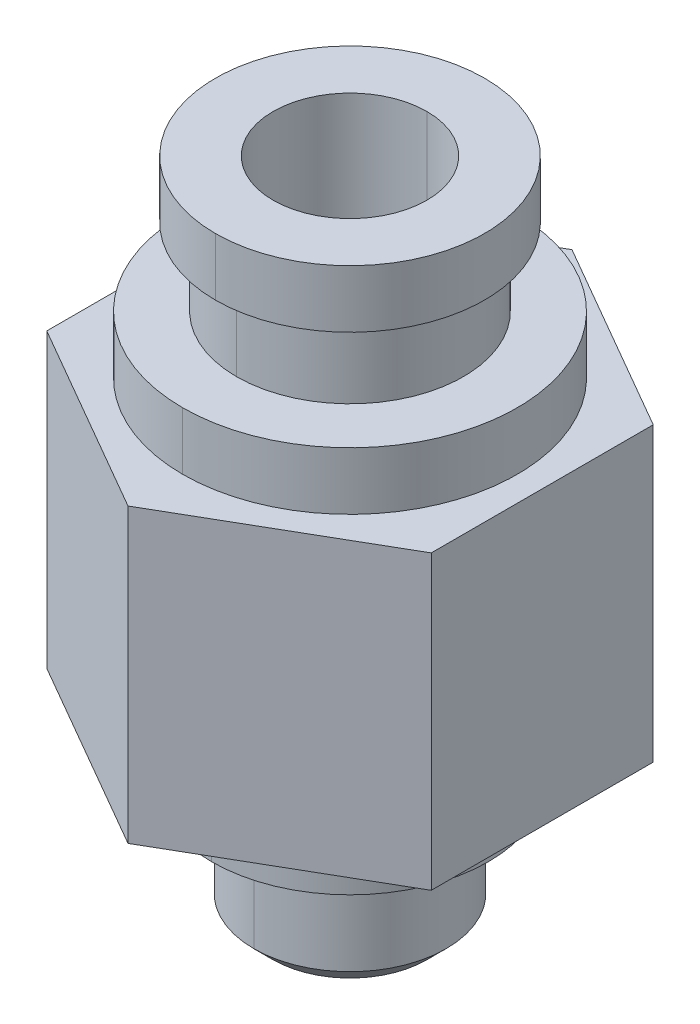
ISO-10303-21;
HEADER;
FILE_DESCRIPTION(('STEP AP214'),'2;1');
FILE_NAME('part.step','',(''),(''),'','','');
FILE_SCHEMA(('AUTOMOTIVE_DESIGN { 1 0 10303 214 1 1 1 1 }'));
ENDSEC;
DATA;
#1=APPLICATION_CONTEXT('core data for automotive mechanical design processes');
#2=APPLICATION_PROTOCOL_DEFINITION('international standard','automotive_design',2000,#1);
#3=PRODUCT_CONTEXT('',#1,'mechanical');
#4=PRODUCT('Part','Part','',(#3));
#5=PRODUCT_RELATED_PRODUCT_CATEGORY('part','',(#4));
#6=PRODUCT_DEFINITION_FORMATION('','',#4);
#7=PRODUCT_DEFINITION_CONTEXT('part definition',#1,'design');
#8=PRODUCT_DEFINITION('design','',#6,#7);
#9=PRODUCT_DEFINITION_SHAPE('','',#8);
#10=(LENGTH_UNIT() NAMED_UNIT(*) SI_UNIT(.MILLI.,.METRE.));
#11=(NAMED_UNIT(*) PLANE_ANGLE_UNIT() SI_UNIT($,.RADIAN.));
#12=(NAMED_UNIT(*) SI_UNIT($,.STERADIAN.) SOLID_ANGLE_UNIT());
#13=UNCERTAINTY_MEASURE_WITH_UNIT(LENGTH_MEASURE(1.E-05),#10,'distance_accuracy_value','');
#14=(GEOMETRIC_REPRESENTATION_CONTEXT(3) GLOBAL_UNCERTAINTY_ASSIGNED_CONTEXT((#13)) GLOBAL_UNIT_ASSIGNED_CONTEXT((#10,
#11,#12)) REPRESENTATION_CONTEXT('',''));
#15=CARTESIAN_POINT('',(0.,0.,0.));
#16=DIRECTION('',(0.,0.,1.));
#17=DIRECTION('',(1.,0.,0.));
#18=AXIS2_PLACEMENT_3D('',#15,#16,#17);
#19=CARTESIAN_POINT('',(0.,4.5,0.));
#20=DIRECTION('',(0.,1.,0.));
#21=DIRECTION('',(0.,0.,1.));
#22=AXIS2_PLACEMENT_3D('',#19,#20,#21);
#23=PLANE('',#22);
#24=CARTESIAN_POINT('',(0.,4.5,0.));
#25=DIRECTION('',(0.,-1.,0.));
#26=DIRECTION('',(0.,0.,-1.));
#27=AXIS2_PLACEMENT_3D('',#24,#25,#26);
#28=CIRCLE('',#27,3.6);
#29=CARTESIAN_POINT('',(0.,4.5,3.6));
#30=VERTEX_POINT('',#29);
#31=CARTESIAN_POINT('',(0.,4.5,-3.6));
#32=VERTEX_POINT('',#31);
#33=EDGE_CURVE('E120',#30,#32,#28,.T.);
#34=ORIENTED_EDGE('',*,*,#33,.F.);
#35=CARTESIAN_POINT('',(0.,4.5,0.));
#36=DIRECTION('',(0.,-1.,0.));
#37=DIRECTION('',(0.,0.,-1.));
#38=AXIS2_PLACEMENT_3D('',#35,#36,#37);
#39=CIRCLE('',#38,3.6);
#40=EDGE_CURVE('E20',#32,#30,#39,.T.);
#41=ORIENTED_EDGE('',*,*,#40,.F.);
#42=EDGE_LOOP('',(#34,#41));
#43=FACE_BOUND('',#42,.T.);
#44=DIRECTION('',(-0.866025403784439,0.,0.5));
#45=VECTOR('',#44,1.);
#46=CARTESIAN_POINT('',(0.,4.5,5.77350269189626));
#47=LINE('',#46,#45);
#48=CARTESIAN_POINT('',(5.,4.5,2.88675134594813));
#49=VERTEX_POINT('',#48);
#50=CARTESIAN_POINT('',(0.,4.5,5.77350269189626));
#51=VERTEX_POINT('',#50);
#52=EDGE_CURVE('E221',#49,#51,#47,.T.);
#53=ORIENTED_EDGE('',*,*,#52,.T.);
#54=DIRECTION('',(-0.866025403784439,0.,-0.5));
#55=VECTOR('',#54,1.);
#56=CARTESIAN_POINT('',(-5.,4.5,2.88675134594813));
#57=LINE('',#56,#55);
#58=CARTESIAN_POINT('',(-5.,4.5,2.88675134594813));
#59=VERTEX_POINT('',#58);
#60=EDGE_CURVE('E140',#51,#59,#57,.T.);
#61=ORIENTED_EDGE('',*,*,#60,.T.);
#62=DIRECTION('',(0.,0.,-1.));
#63=VECTOR('',#62,1.);
#64=CARTESIAN_POINT('',(-5.,4.5,-2.88675134594813));
#65=LINE('',#64,#63);
#66=CARTESIAN_POINT('',(-5.,4.5,-2.88675134594813));
#67=VERTEX_POINT('',#66);
#68=EDGE_CURVE('E248',#59,#67,#65,.T.);
#69=ORIENTED_EDGE('',*,*,#68,.T.);
#70=DIRECTION('',(0.866025403784439,0.,-0.5));
#71=VECTOR('',#70,1.);
#72=CARTESIAN_POINT('',(0.,4.5,-5.77350269189626));
#73=LINE('',#72,#71);
#74=CARTESIAN_POINT('',(0.,4.5,-5.77350269189626));
#75=VERTEX_POINT('',#74);
#76=EDGE_CURVE('E239',#67,#75,#73,.T.);
#77=ORIENTED_EDGE('',*,*,#76,.T.);
#78=DIRECTION('',(0.866025403784439,0.,0.5));
#79=VECTOR('',#78,1.);
#80=CARTESIAN_POINT('',(5.,4.5,-2.88675134594813));
#81=LINE('',#80,#79);
#82=CARTESIAN_POINT('',(5.,4.5,-2.88675134594813));
#83=VERTEX_POINT('',#82);
#84=EDGE_CURVE('E233',#75,#83,#81,.T.);
#85=ORIENTED_EDGE('',*,*,#84,.T.);
#86=DIRECTION('',(0.,0.,1.));
#87=VECTOR('',#86,1.);
#88=CARTESIAN_POINT('',(5.,4.5,2.88675134594813));
#89=LINE('',#88,#87);
#90=EDGE_CURVE('E227',#83,#49,#89,.T.);
#91=ORIENTED_EDGE('',*,*,#90,.T.);
#92=EDGE_LOOP('',(#53,#61,#69,#77,#85,#91));
#93=FACE_BOUND('',#92,.T.);
#94=ADVANCED_FACE('F17',(#43,#93),#23,.F.);
#95=CARTESIAN_POINT('',(0.,4.5,0.));
#96=DIRECTION('',(0.,-1.,0.));
#97=DIRECTION('',(0.,0.,-1.));
#98=AXIS2_PLACEMENT_3D('',#95,#96,#97);
#99=CYLINDRICAL_SURFACE('',#98,3.6);
#100=CARTESIAN_POINT('',(0.,3.,0.));
#101=DIRECTION('',(0.,-1.,0.));
#102=DIRECTION('',(0.,0.,-1.));
#103=AXIS2_PLACEMENT_3D('',#100,#101,#102);
#104=CIRCLE('',#103,3.6);
#105=CARTESIAN_POINT('',(0.,3.,3.6));
#106=VERTEX_POINT('',#105);
#107=CARTESIAN_POINT('',(0.,3.,-3.6));
#108=VERTEX_POINT('',#107);
#109=EDGE_CURVE('E143',#106,#108,#104,.F.);
#110=ORIENTED_EDGE('',*,*,#109,.T.);
#111=DIRECTION('',(0.,-1.,0.));
#112=VECTOR('',#111,1.);
#113=CARTESIAN_POINT('',(0.,4.5,-3.6));
#114=LINE('',#113,#112);
#115=EDGE_CURVE('E133',#32,#108,#114,.T.);
#116=ORIENTED_EDGE('',*,*,#115,.F.);
#117=ORIENTED_EDGE('',*,*,#40,.T.);
#118=DIRECTION('',(0.,-1.,0.));
#119=VECTOR('',#118,1.);
#120=CARTESIAN_POINT('',(0.,4.5,3.6));
#121=LINE('',#120,#119);
#122=EDGE_CURVE('E131',#106,#30,#121,.F.);
#123=ORIENTED_EDGE('',*,*,#122,.F.);
#124=EDGE_LOOP('',(#110,#116,#117,#123));
#125=FACE_BOUND('',#124,.T.);
#126=ADVANCED_FACE('F130',(#125),#99,.T.);
#127=CARTESIAN_POINT('',(0.,4.5,0.));
#128=DIRECTION('',(0.,-1.,0.));
#129=DIRECTION('',(0.,0.,-1.));
#130=AXIS2_PLACEMENT_3D('',#127,#128,#129);
#131=CYLINDRICAL_SURFACE('',#130,3.6);
#132=ORIENTED_EDGE('',*,*,#115,.T.);
#133=CARTESIAN_POINT('',(0.,3.,0.));
#134=DIRECTION('',(0.,-1.,0.));
#135=DIRECTION('',(0.,0.,-1.));
#136=AXIS2_PLACEMENT_3D('',#133,#134,#135);
#137=CIRCLE('',#136,3.6);
#138=EDGE_CURVE('E137',#108,#106,#137,.F.);
#139=ORIENTED_EDGE('',*,*,#138,.T.);
#140=ORIENTED_EDGE('',*,*,#122,.T.);
#141=ORIENTED_EDGE('',*,*,#33,.T.);
#142=EDGE_LOOP('',(#132,#139,#140,#141));
#143=FACE_BOUND('',#142,.T.);
#144=ADVANCED_FACE('F135',(#143),#131,.T.);
#145=CARTESIAN_POINT('',(-5.,12.1,2.88675134594813));
#146=DIRECTION('',(0.5,0.,-0.866025403784439));
#147=DIRECTION('',(-0.866025403784439,0.,-0.5));
#148=AXIS2_PLACEMENT_3D('',#145,#146,#147);
#149=PLANE('',#148);
#150=DIRECTION('',(0.,1.,0.));
#151=VECTOR('',#150,1.);
#152=CARTESIAN_POINT('',(-5.,12.1,2.88675134594813));
#153=LINE('',#152,#151);
#154=CARTESIAN_POINT('',(-5.,12.1,2.88675134594813));
#155=VERTEX_POINT('',#154);
#156=EDGE_CURVE('E245',#155,#59,#153,.F.);
#157=ORIENTED_EDGE('',*,*,#156,.T.);
#158=ORIENTED_EDGE('',*,*,#60,.F.);
#159=DIRECTION('',(0.,1.,0.));
#160=VECTOR('',#159,1.);
#161=CARTESIAN_POINT('',(0.,12.1,5.77350269189626));
#162=LINE('',#161,#160);
#163=CARTESIAN_POINT('',(0.,12.1,5.77350269189626));
#164=VERTEX_POINT('',#163);
#165=EDGE_CURVE('E224',#51,#164,#162,.T.);
#166=ORIENTED_EDGE('',*,*,#165,.T.);
#167=DIRECTION('',(0.866025403784439,0.,0.5));
#168=VECTOR('',#167,1.);
#169=CARTESIAN_POINT('',(-5.,12.1,2.88675134594813));
#170=LINE('',#169,#168);
#171=EDGE_CURVE('E147',#155,#164,#170,.T.);
#172=ORIENTED_EDGE('',*,*,#171,.F.);
#173=EDGE_LOOP('',(#157,#158,#166,#172));
#174=FACE_BOUND('',#173,.T.);
#175=ADVANCED_FACE('F457',(#174),#149,.F.);
#176=CARTESIAN_POINT('',(0.,12.1,5.77350269189626));
#177=DIRECTION('',(-0.5,0.,-0.866025403784439));
#178=DIRECTION('',(-0.866025403784439,0.,0.5));
#179=AXIS2_PLACEMENT_3D('',#176,#177,#178);
#180=PLANE('',#179);
#181=ORIENTED_EDGE('',*,*,#165,.F.);
#182=ORIENTED_EDGE('',*,*,#52,.F.);
#183=DIRECTION('',(0.,1.,0.));
#184=VECTOR('',#183,1.);
#185=CARTESIAN_POINT('',(5.,12.1,2.88675134594813));
#186=LINE('',#185,#184);
#187=CARTESIAN_POINT('',(5.,12.1,2.88675134594813));
#188=VERTEX_POINT('',#187);
#189=EDGE_CURVE('E230',#49,#188,#186,.T.);
#190=ORIENTED_EDGE('',*,*,#189,.T.);
#191=DIRECTION('',(0.866025403784439,0.,-0.5));
#192=VECTOR('',#191,1.);
#193=CARTESIAN_POINT('',(0.,12.1,5.77350269189626));
#194=LINE('',#193,#192);
#195=EDGE_CURVE('E255',#164,#188,#194,.T.);
#196=ORIENTED_EDGE('',*,*,#195,.F.);
#197=EDGE_LOOP('',(#181,#182,#190,#196));
#198=FACE_BOUND('',#197,.T.);
#199=ADVANCED_FACE('F453',(#198),#180,.F.);
#200=CARTESIAN_POINT('',(5.,12.1,2.88675134594813));
#201=DIRECTION('',(-1.,0.,0.));
#202=DIRECTION('',(0.,0.,1.));
#203=AXIS2_PLACEMENT_3D('',#200,#201,#202);
#204=PLANE('',#203);
#205=ORIENTED_EDGE('',*,*,#189,.F.);
#206=ORIENTED_EDGE('',*,*,#90,.F.);
#207=DIRECTION('',(0.,1.,0.));
#208=VECTOR('',#207,1.);
#209=CARTESIAN_POINT('',(5.,12.1,-2.88675134594813));
#210=LINE('',#209,#208);
#211=CARTESIAN_POINT('',(5.,12.1,-2.88675134594813));
#212=VERTEX_POINT('',#211);
#213=EDGE_CURVE('E236',#83,#212,#210,.T.);
#214=ORIENTED_EDGE('',*,*,#213,.T.);
#215=DIRECTION('',(0.,0.,1.));
#216=VECTOR('',#215,1.);
#217=CARTESIAN_POINT('',(5.,12.1,0.));
#218=LINE('',#217,#216);
#219=EDGE_CURVE('E258',#188,#212,#218,.F.);
#220=ORIENTED_EDGE('',*,*,#219,.F.);
#221=EDGE_LOOP('',(#205,#206,#214,#220));
#222=FACE_BOUND('',#221,.T.);
#223=ADVANCED_FACE('F449',(#222),#204,.F.);
#224=CARTESIAN_POINT('',(5.,12.1,-2.88675134594813));
#225=DIRECTION('',(-0.5,0.,0.866025403784439));
#226=DIRECTION('',(0.866025403784439,0.,0.5));
#227=AXIS2_PLACEMENT_3D('',#224,#225,#226);
#228=PLANE('',#227);
#229=ORIENTED_EDGE('',*,*,#213,.F.);
#230=ORIENTED_EDGE('',*,*,#84,.F.);
#231=DIRECTION('',(0.,1.,0.));
#232=VECTOR('',#231,1.);
#233=CARTESIAN_POINT('',(0.,12.1,-5.77350269189626));
#234=LINE('',#233,#232);
#235=CARTESIAN_POINT('',(0.,12.1,-5.77350269189626));
#236=VERTEX_POINT('',#235);
#237=EDGE_CURVE('E242',#75,#236,#234,.T.);
#238=ORIENTED_EDGE('',*,*,#237,.T.);
#239=DIRECTION('',(-0.866025403784439,0.,-0.5));
#240=VECTOR('',#239,1.);
#241=CARTESIAN_POINT('',(5.,12.1,-2.88675134594813));
#242=LINE('',#241,#240);
#243=EDGE_CURVE('E261',#212,#236,#242,.T.);
#244=ORIENTED_EDGE('',*,*,#243,.F.);
#245=EDGE_LOOP('',(#229,#230,#238,#244));
#246=FACE_BOUND('',#245,.T.);
#247=ADVANCED_FACE('F445',(#246),#228,.F.);
#248=CARTESIAN_POINT('',(0.,12.1,-5.77350269189626));
#249=DIRECTION('',(0.5,0.,0.866025403784439));
#250=DIRECTION('',(0.866025403784439,0.,-0.5));
#251=AXIS2_PLACEMENT_3D('',#248,#249,#250);
#252=PLANE('',#251);
#253=ORIENTED_EDGE('',*,*,#237,.F.);
#254=ORIENTED_EDGE('',*,*,#76,.F.);
#255=DIRECTION('',(0.,1.,0.));
#256=VECTOR('',#255,1.);
#257=CARTESIAN_POINT('',(-5.,12.1,-2.88675134594813));
#258=LINE('',#257,#256);
#259=CARTESIAN_POINT('',(-5.,12.1,-2.88675134594813));
#260=VERTEX_POINT('',#259);
#261=EDGE_CURVE('E145',#67,#260,#258,.T.);
#262=ORIENTED_EDGE('',*,*,#261,.T.);
#263=DIRECTION('',(-0.866025403784439,0.,0.5));
#264=VECTOR('',#263,1.);
#265=CARTESIAN_POINT('',(0.,12.1,-5.77350269189626));
#266=LINE('',#265,#264);
#267=EDGE_CURVE('E264',#236,#260,#266,.T.);
#268=ORIENTED_EDGE('',*,*,#267,.F.);
#269=EDGE_LOOP('',(#253,#254,#262,#268));
#270=FACE_BOUND('',#269,.T.);
#271=ADVANCED_FACE('F441',(#270),#252,.F.);
#272=CARTESIAN_POINT('',(-5.,12.1,-2.88675134594813));
#273=DIRECTION('',(1.,0.,0.));
#274=DIRECTION('',(0.,0.,-1.));
#275=AXIS2_PLACEMENT_3D('',#272,#273,#274);
#276=PLANE('',#275);
#277=ORIENTED_EDGE('',*,*,#261,.F.);
#278=ORIENTED_EDGE('',*,*,#68,.F.);
#279=ORIENTED_EDGE('',*,*,#156,.F.);
#280=DIRECTION('',(0.,0.,1.));
#281=VECTOR('',#280,1.);
#282=CARTESIAN_POINT('',(-5.,12.1,0.));
#283=LINE('',#282,#281);
#284=EDGE_CURVE('E151',#260,#155,#283,.T.);
#285=ORIENTED_EDGE('',*,*,#284,.F.);
#286=EDGE_LOOP('',(#277,#278,#279,#285));
#287=FACE_BOUND('',#286,.T.);
#288=ADVANCED_FACE('F437',(#287),#276,.F.);
#289=CARTESIAN_POINT('',(0.,3.,2.0095));
#290=DIRECTION('',(0.,1.,0.));
#291=DIRECTION('',(0.,0.,1.));
#292=AXIS2_PLACEMENT_3D('',#289,#290,#291);
#293=PLANE('',#292);
#294=CARTESIAN_POINT('',(0.,3.00000000004275,0.));
#295=DIRECTION('',(0.,-1.,0.));
#296=DIRECTION('',(0.,0.,-1.));
#297=AXIS2_PLACEMENT_3D('',#294,#295,#296);
#298=CIRCLE('',#297,2.00949999998556);
#299=CARTESIAN_POINT('',(0.,3.00000000004275,2.00949999998556));
#300=VERTEX_POINT('',#299);
#301=CARTESIAN_POINT('',(0.,3.00000000004275,-2.00949999998556));
#302=VERTEX_POINT('',#301);
#303=EDGE_CURVE('E148',#300,#302,#298,.T.);
#304=ORIENTED_EDGE('',*,*,#303,.F.);
#305=CARTESIAN_POINT('',(0.,3.00000000004275,0.));
#306=DIRECTION('',(0.,-1.,0.));
#307=DIRECTION('',(0.,0.,-1.));
#308=AXIS2_PLACEMENT_3D('',#305,#306,#307);
#309=CIRCLE('',#308,2.00949999998556);
#310=EDGE_CURVE('E150',#302,#300,#309,.T.);
#311=ORIENTED_EDGE('',*,*,#310,.F.);
#312=EDGE_LOOP('',(#304,#311));
#313=FACE_BOUND('',#312,.T.);
#314=ORIENTED_EDGE('',*,*,#109,.F.);
#315=ORIENTED_EDGE('',*,*,#138,.F.);
#316=EDGE_LOOP('',(#314,#315));
#317=FACE_BOUND('',#316,.T.);
#318=ADVANCED_FACE('F433',(#313,#317),#293,.F.);
#319=CARTESIAN_POINT('',(0.,12.1,0.));
#320=DIRECTION('',(0.,1.,0.));
#321=DIRECTION('',(0.,0.,1.));
#322=AXIS2_PLACEMENT_3D('',#319,#320,#321);
#323=PLANE('',#322);
#324=CARTESIAN_POINT('',(0.,12.1,0.));
#325=DIRECTION('',(0.,-1.,0.));
#326=DIRECTION('',(0.,0.,-1.));
#327=AXIS2_PLACEMENT_3D('',#324,#325,#326);
#328=CIRCLE('',#327,4.35);
#329=CARTESIAN_POINT('',(0.,12.1,-4.35));
#330=VERTEX_POINT('',#329);
#331=CARTESIAN_POINT('',(0.,12.1,4.35));
#332=VERTEX_POINT('',#331);
#333=EDGE_CURVE('E154',#330,#332,#328,.F.);
#334=ORIENTED_EDGE('',*,*,#333,.F.);
#335=CARTESIAN_POINT('',(0.,12.1,0.));
#336=DIRECTION('',(0.,-1.,0.));
#337=DIRECTION('',(0.,0.,-1.));
#338=AXIS2_PLACEMENT_3D('',#335,#336,#337);
#339=CIRCLE('',#338,4.35);
#340=EDGE_CURVE('E158',#332,#330,#339,.F.);
#341=ORIENTED_EDGE('',*,*,#340,.F.);
#342=EDGE_LOOP('',(#334,#341));
#343=FACE_BOUND('',#342,.T.);
#344=ORIENTED_EDGE('',*,*,#267,.T.);
#345=ORIENTED_EDGE('',*,*,#284,.T.);
#346=ORIENTED_EDGE('',*,*,#171,.T.);
#347=ORIENTED_EDGE('',*,*,#195,.T.);
#348=ORIENTED_EDGE('',*,*,#219,.T.);
#349=ORIENTED_EDGE('',*,*,#243,.T.);
#350=EDGE_LOOP('',(#344,#345,#346,#347,#348,#349));
#351=FACE_BOUND('',#350,.T.);
#352=ADVANCED_FACE('F429',(#343,#351),#323,.T.);
#353=CARTESIAN_POINT('',(0.,2.50950000008743,0.));
#354=DIRECTION('',(0.,-1.,0.));
#355=DIRECTION('',(0.,0.,-1.));
#356=AXIS2_PLACEMENT_3D('',#353,#354,#355);
#357=CONICAL_SURFACE('',#356,2.49999999994088,0.785398163397448);
#358=DIRECTION('',(0.,0.707106781186548,0.707106781186548));
#359=VECTOR('',#358,1.);
#360=CARTESIAN_POINT('',(0.,-498994.9905,-499000.));
#361=LINE('',#360,#359);
#362=CARTESIAN_POINT('',(0.,2.50950000000216,-2.49999999998522));
#363=VERTEX_POINT('',#362);
#364=EDGE_CURVE('E157',#363,#302,#361,.T.);
#365=ORIENTED_EDGE('',*,*,#364,.F.);
#366=CARTESIAN_POINT('',(0.,2.50949999997374,0.));
#367=DIRECTION('',(0.,-1.,0.));
#368=DIRECTION('',(0.,0.,-1.));
#369=AXIS2_PLACEMENT_3D('',#366,#367,#368);
#370=CIRCLE('',#369,2.5);
#371=CARTESIAN_POINT('',(0.,2.50950000000216,2.49999999998522));
#372=VERTEX_POINT('',#371);
#373=EDGE_CURVE('E283',#372,#363,#370,.T.);
#374=ORIENTED_EDGE('',*,*,#373,.F.);
#375=DIRECTION('',(0.,0.707106781186548,-0.707106781186548));
#376=VECTOR('',#375,1.);
#377=CARTESIAN_POINT('',(6.11098752774529E-11,-498994.9905,499000.));
#378=LINE('',#377,#376);
#379=EDGE_CURVE('E153',#300,#372,#378,.F.);
#380=ORIENTED_EDGE('',*,*,#379,.F.);
#381=ORIENTED_EDGE('',*,*,#303,.T.);
#382=EDGE_LOOP('',(#365,#374,#380,#381));
#383=FACE_BOUND('',#382,.T.);
#384=ADVANCED_FACE('F425',(#383),#357,.T.);
#385=CARTESIAN_POINT('',(0.,2.50950000008743,0.));
#386=DIRECTION('',(0.,-1.,0.));
#387=DIRECTION('',(0.,0.,-1.));
#388=AXIS2_PLACEMENT_3D('',#385,#386,#387);
#389=CONICAL_SURFACE('',#388,2.49999999994088,0.785398163397448);
#390=CARTESIAN_POINT('',(0.,2.50949999997374,0.));
#391=DIRECTION('',(0.,-1.,0.));
#392=DIRECTION('',(0.,0.,-1.));
#393=AXIS2_PLACEMENT_3D('',#390,#391,#392);
#394=CIRCLE('',#393,2.5);
#395=EDGE_CURVE('E279',#363,#372,#394,.T.);
#396=ORIENTED_EDGE('',*,*,#395,.F.);
#397=ORIENTED_EDGE('',*,*,#364,.T.);
#398=ORIENTED_EDGE('',*,*,#310,.T.);
#399=ORIENTED_EDGE('',*,*,#379,.T.);
#400=EDGE_LOOP('',(#396,#397,#398,#399));
#401=FACE_BOUND('',#400,.T.);
#402=ADVANCED_FACE('F421',(#401),#389,.T.);
#403=CARTESIAN_POINT('',(0.,17.1,0.));
#404=DIRECTION('',(0.,-1.,0.));
#405=DIRECTION('',(0.,0.,-1.));
#406=AXIS2_PLACEMENT_3D('',#403,#404,#405);
#407=CYLINDRICAL_SURFACE('',#406,4.35);
#408=DIRECTION('',(0.,-1.,0.));
#409=VECTOR('',#408,1.);
#410=CARTESIAN_POINT('',(0.,17.1,-4.35));
#411=LINE('',#410,#409);
#412=CARTESIAN_POINT('',(0.,13.6,-4.35));
#413=VERTEX_POINT('',#412);
#414=EDGE_CURVE('E160',#330,#413,#411,.F.);
#415=ORIENTED_EDGE('',*,*,#414,.F.);
#416=ORIENTED_EDGE('',*,*,#333,.T.);
#417=DIRECTION('',(0.,-1.,0.));
#418=VECTOR('',#417,1.);
#419=CARTESIAN_POINT('',(0.,17.1,4.35));
#420=LINE('',#419,#418);
#421=CARTESIAN_POINT('',(0.,13.6,4.35));
#422=VERTEX_POINT('',#421);
#423=EDGE_CURVE('E156',#422,#332,#420,.T.);
#424=ORIENTED_EDGE('',*,*,#423,.F.);
#425=CARTESIAN_POINT('',(0.,13.6,0.));
#426=DIRECTION('',(0.,-1.,0.));
#427=DIRECTION('',(0.,0.,-1.));
#428=AXIS2_PLACEMENT_3D('',#425,#426,#427);
#429=CIRCLE('',#428,4.35);
#430=EDGE_CURVE('E161',#422,#413,#429,.T.);
#431=ORIENTED_EDGE('',*,*,#430,.T.);
#432=EDGE_LOOP('',(#415,#416,#424,#431));
#433=FACE_BOUND('',#432,.T.);
#434=ADVANCED_FACE('F417',(#433),#407,.T.);
#435=CARTESIAN_POINT('',(0.,17.1,0.));
#436=DIRECTION('',(0.,-1.,0.));
#437=DIRECTION('',(0.,0.,-1.));
#438=AXIS2_PLACEMENT_3D('',#435,#436,#437);
#439=CYLINDRICAL_SURFACE('',#438,4.35);
#440=ORIENTED_EDGE('',*,*,#340,.T.);
#441=ORIENTED_EDGE('',*,*,#414,.T.);
#442=CARTESIAN_POINT('',(0.,13.6,0.));
#443=DIRECTION('',(0.,-1.,0.));
#444=DIRECTION('',(0.,0.,-1.));
#445=AXIS2_PLACEMENT_3D('',#442,#443,#444);
#446=CIRCLE('',#445,4.35);
#447=EDGE_CURVE('E164',#413,#422,#446,.T.);
#448=ORIENTED_EDGE('',*,*,#447,.T.);
#449=ORIENTED_EDGE('',*,*,#423,.T.);
#450=EDGE_LOOP('',(#440,#441,#448,#449));
#451=FACE_BOUND('',#450,.T.);
#452=ADVANCED_FACE('F413',(#451),#439,.T.);
#453=CARTESIAN_POINT('',(0.,4.5,0.));
#454=DIRECTION('',(0.,-1.,0.));
#455=DIRECTION('',(0.,0.,-1.));
#456=AXIS2_PLACEMENT_3D('',#453,#454,#455);
#457=CYLINDRICAL_SURFACE('',#456,2.5);
#458=DIRECTION('',(0.,-1.,0.));
#459=VECTOR('',#458,1.);
#460=CARTESIAN_POINT('',(0.,4.5,-2.5));
#461=LINE('',#460,#459);
#462=CARTESIAN_POINT('',(0.,0.490499999912686,-2.50000000002672));
#463=VERTEX_POINT('',#462);
#464=EDGE_CURVE('E165',#463,#363,#461,.F.);
#465=ORIENTED_EDGE('',*,*,#464,.F.);
#466=CARTESIAN_POINT('',(0.,0.490499999955318,0.));
#467=DIRECTION('',(0.,1.,0.));
#468=DIRECTION('',(0.,0.,1.));
#469=AXIS2_PLACEMENT_3D('',#466,#467,#468);
#470=CIRCLE('',#469,2.50000000005457);
#471=CARTESIAN_POINT('',(0.,0.490499999926897,2.50000000002672));
#472=VERTEX_POINT('',#471);
#473=EDGE_CURVE('E168',#472,#463,#470,.F.);
#474=ORIENTED_EDGE('',*,*,#473,.F.);
#475=DIRECTION('',(0.,-1.,0.));
#476=VECTOR('',#475,1.);
#477=CARTESIAN_POINT('',(0.,4.5,2.5));
#478=LINE('',#477,#476);
#479=EDGE_CURVE('E282',#372,#472,#478,.T.);
#480=ORIENTED_EDGE('',*,*,#479,.F.);
#481=ORIENTED_EDGE('',*,*,#373,.T.);
#482=EDGE_LOOP('',(#465,#474,#480,#481));
#483=FACE_BOUND('',#482,.T.);
#484=ADVANCED_FACE('F409',(#483),#457,.T.);
#485=CARTESIAN_POINT('',(0.,4.5,0.));
#486=DIRECTION('',(0.,-1.,0.));
#487=DIRECTION('',(0.,0.,-1.));
#488=AXIS2_PLACEMENT_3D('',#485,#486,#487);
#489=CYLINDRICAL_SURFACE('',#488,2.5);
#490=CARTESIAN_POINT('',(0.,0.490499999955318,0.));
#491=DIRECTION('',(0.,1.,0.));
#492=DIRECTION('',(0.,0.,1.));
#493=AXIS2_PLACEMENT_3D('',#490,#491,#492);
#494=CIRCLE('',#493,2.50000000005457);
#495=EDGE_CURVE('E301',#463,#472,#494,.F.);
#496=ORIENTED_EDGE('',*,*,#495,.F.);
#497=ORIENTED_EDGE('',*,*,#464,.T.);
#498=ORIENTED_EDGE('',*,*,#395,.T.);
#499=ORIENTED_EDGE('',*,*,#479,.T.);
#500=EDGE_LOOP('',(#496,#497,#498,#499));
#501=FACE_BOUND('',#500,.T.);
#502=ADVANCED_FACE('F405',(#501),#489,.T.);
#503=CARTESIAN_POINT('',(0.,13.6,4.35));
#504=DIRECTION('',(0.,-1.,0.));
#505=DIRECTION('',(0.,0.,-1.));
#506=AXIS2_PLACEMENT_3D('',#503,#504,#505);
#507=PLANE('',#506);
#508=ORIENTED_EDGE('',*,*,#430,.F.);
#509=ORIENTED_EDGE('',*,*,#447,.F.);
#510=EDGE_LOOP('',(#508,#509));
#511=FACE_BOUND('',#510,.T.);
#512=CARTESIAN_POINT('',(0.,13.6,0.));
#513=DIRECTION('',(0.,-1.,0.));
#514=DIRECTION('',(0.,0.,-1.));
#515=AXIS2_PLACEMENT_3D('',#512,#513,#514);
#516=CIRCLE('',#515,2.95);
#517=CARTESIAN_POINT('',(0.,13.6,2.95));
#518=VERTEX_POINT('',#517);
#519=CARTESIAN_POINT('',(0.,13.6,-2.95));
#520=VERTEX_POINT('',#519);
#521=EDGE_CURVE('E173',#518,#520,#516,.F.);
#522=ORIENTED_EDGE('',*,*,#521,.F.);
#523=CARTESIAN_POINT('',(0.,13.6,0.));
#524=DIRECTION('',(0.,-1.,0.));
#525=DIRECTION('',(0.,0.,-1.));
#526=AXIS2_PLACEMENT_3D('',#523,#524,#525);
#527=CIRCLE('',#526,2.95);
#528=EDGE_CURVE('E169',#520,#518,#527,.F.);
#529=ORIENTED_EDGE('',*,*,#528,.F.);
#530=EDGE_LOOP('',(#522,#529));
#531=FACE_BOUND('',#530,.T.);
#532=ADVANCED_FACE('F401',(#511,#531),#507,.F.);
#533=CARTESIAN_POINT('',(0.,0.490499999841632,0.));
#534=DIRECTION('',(0.,1.,0.));
#535=DIRECTION('',(0.,0.,1.));
#536=AXIS2_PLACEMENT_3D('',#533,#534,#535);
#537=CONICAL_SURFACE('',#536,2.49999999999773,0.785398163455393);
#538=DIRECTION('',(0.,-0.707106781145575,-0.70710678122752));
#539=VECTOR('',#538,1.);
#540=CARTESIAN_POINT('',(0.,498997.990442172,499000.));
#541=LINE('',#540,#539);
#542=CARTESIAN_POINT('',(0.,-8.5265128291212E-11,2.00949999998556));
#543=VERTEX_POINT('',#542);
#544=EDGE_CURVE('E172',#472,#543,#541,.T.);
#545=ORIENTED_EDGE('',*,*,#544,.F.);
#546=ORIENTED_EDGE('',*,*,#473,.T.);
#547=DIRECTION('',(0.,-0.707106781145575,0.70710678122752));
#548=VECTOR('',#547,1.);
#549=CARTESIAN_POINT('',(6.11098752774529E-11,498997.990442172,-499000.));
#550=LINE('',#549,#548);
#551=CARTESIAN_POINT('',(0.,-8.5265128291212E-11,-2.00949999998556));
#552=VERTEX_POINT('',#551);
#553=EDGE_CURVE('E304',#552,#463,#550,.F.);
#554=ORIENTED_EDGE('',*,*,#553,.F.);
#555=CARTESIAN_POINT('',(0.,-1.13686837721616E-10,0.));
#556=DIRECTION('',(0.,1.,0.));
#557=DIRECTION('',(0.,0.,1.));
#558=AXIS2_PLACEMENT_3D('',#555,#556,#557);
#559=CIRCLE('',#558,2.00949999998556);
#560=EDGE_CURVE('E176',#552,#543,#559,.T.);
#561=ORIENTED_EDGE('',*,*,#560,.T.);
#562=EDGE_LOOP('',(#545,#546,#554,#561));
#563=FACE_BOUND('',#562,.T.);
#564=ADVANCED_FACE('F397',(#563),#537,.T.);
#565=CARTESIAN_POINT('',(0.,0.490499999841632,0.));
#566=DIRECTION('',(0.,1.,0.));
#567=DIRECTION('',(0.,0.,1.));
#568=AXIS2_PLACEMENT_3D('',#565,#566,#567);
#569=CONICAL_SURFACE('',#568,2.49999999999773,0.785398163455393);
#570=ORIENTED_EDGE('',*,*,#495,.T.);
#571=ORIENTED_EDGE('',*,*,#544,.T.);
#572=CARTESIAN_POINT('',(0.,-1.13686837721616E-10,0.));
#573=DIRECTION('',(0.,1.,0.));
#574=DIRECTION('',(0.,0.,1.));
#575=AXIS2_PLACEMENT_3D('',#572,#573,#574);
#576=CIRCLE('',#575,2.00949999998556);
#577=EDGE_CURVE('E179',#543,#552,#576,.T.);
#578=ORIENTED_EDGE('',*,*,#577,.T.);
#579=ORIENTED_EDGE('',*,*,#553,.T.);
#580=EDGE_LOOP('',(#570,#571,#578,#579));
#581=FACE_BOUND('',#580,.T.);
#582=ADVANCED_FACE('F393',(#581),#569,.T.);
#583=CARTESIAN_POINT('',(0.,17.1,0.));
#584=DIRECTION('',(0.,-1.,0.));
#585=DIRECTION('',(0.,0.,-1.));
#586=AXIS2_PLACEMENT_3D('',#583,#584,#585);
#587=CYLINDRICAL_SURFACE('',#586,2.95);
#588=DIRECTION('',(0.,-1.,0.));
#589=VECTOR('',#588,1.);
#590=CARTESIAN_POINT('',(0.,17.1,-2.95));
#591=LINE('',#590,#589);
#592=CARTESIAN_POINT('',(0.,15.6,-2.95));
#593=VERTEX_POINT('',#592);
#594=EDGE_CURVE('E175',#520,#593,#591,.F.);
#595=ORIENTED_EDGE('',*,*,#594,.F.);
#596=ORIENTED_EDGE('',*,*,#528,.T.);
#597=DIRECTION('',(0.,-1.,0.));
#598=VECTOR('',#597,1.);
#599=CARTESIAN_POINT('',(0.,17.1,2.95));
#600=LINE('',#599,#598);
#601=CARTESIAN_POINT('',(0.,15.6,2.95));
#602=VERTEX_POINT('',#601);
#603=EDGE_CURVE('E171',#602,#518,#600,.T.);
#604=ORIENTED_EDGE('',*,*,#603,.F.);
#605=CARTESIAN_POINT('',(0.,15.6,0.));
#606=DIRECTION('',(0.,-1.,0.));
#607=DIRECTION('',(0.,0.,-1.));
#608=AXIS2_PLACEMENT_3D('',#605,#606,#607);
#609=CIRCLE('',#608,2.95);
#610=EDGE_CURVE('E182',#602,#593,#609,.T.);
#611=ORIENTED_EDGE('',*,*,#610,.T.);
#612=EDGE_LOOP('',(#595,#596,#604,#611));
#613=FACE_BOUND('',#612,.T.);
#614=ADVANCED_FACE('F389',(#613),#587,.T.);
#615=CARTESIAN_POINT('',(0.,17.1,0.));
#616=DIRECTION('',(0.,-1.,0.));
#617=DIRECTION('',(0.,0.,-1.));
#618=AXIS2_PLACEMENT_3D('',#615,#616,#617);
#619=CYLINDRICAL_SURFACE('',#618,2.95);
#620=ORIENTED_EDGE('',*,*,#521,.T.);
#621=ORIENTED_EDGE('',*,*,#594,.T.);
#622=CARTESIAN_POINT('',(0.,15.6,0.));
#623=DIRECTION('',(0.,-1.,0.));
#624=DIRECTION('',(0.,0.,-1.));
#625=AXIS2_PLACEMENT_3D('',#622,#623,#624);
#626=CIRCLE('',#625,2.95);
#627=EDGE_CURVE('E185',#593,#602,#626,.T.);
#628=ORIENTED_EDGE('',*,*,#627,.T.);
#629=ORIENTED_EDGE('',*,*,#603,.T.);
#630=EDGE_LOOP('',(#620,#621,#628,#629));
#631=FACE_BOUND('',#630,.T.);
#632=ADVANCED_FACE('F382',(#631),#619,.T.);
#633=CARTESIAN_POINT('',(0.,0.,0.));
#634=DIRECTION('',(0.,1.,0.));
#635=DIRECTION('',(0.,0.,1.));
#636=AXIS2_PLACEMENT_3D('',#633,#634,#635);
#637=PLANE('',#636);
#638=CARTESIAN_POINT('',(0.,0.,0.));
#639=DIRECTION('',(0.,1.,0.));
#640=DIRECTION('',(0.,0.,1.));
#641=AXIS2_PLACEMENT_3D('',#638,#639,#640);
#642=CIRCLE('',#641,1.5);
#643=CARTESIAN_POINT('',(0.,0.,-1.5));
#644=VERTEX_POINT('',#643);
#645=CARTESIAN_POINT('',(0.,0.,1.5));
#646=VERTEX_POINT('',#645);
#647=EDGE_CURVE('E188',#644,#646,#642,.T.);
#648=ORIENTED_EDGE('',*,*,#647,.T.);
#649=CARTESIAN_POINT('',(0.,0.,0.));
#650=DIRECTION('',(0.,1.,0.));
#651=DIRECTION('',(0.,0.,1.));
#652=AXIS2_PLACEMENT_3D('',#649,#650,#651);
#653=CIRCLE('',#652,1.5);
#654=EDGE_CURVE('E191',#646,#644,#653,.T.);
#655=ORIENTED_EDGE('',*,*,#654,.T.);
#656=EDGE_LOOP('',(#648,#655));
#657=FACE_BOUND('',#656,.T.);
#658=ORIENTED_EDGE('',*,*,#560,.F.);
#659=ORIENTED_EDGE('',*,*,#577,.F.);
#660=EDGE_LOOP('',(#658,#659));
#661=FACE_BOUND('',#660,.T.);
#662=ADVANCED_FACE('F372',(#657,#661),#637,.F.);
#663=CARTESIAN_POINT('',(0.,15.6,2.95));
#664=DIRECTION('',(0.,1.,0.));
#665=DIRECTION('',(0.,0.,1.));
#666=AXIS2_PLACEMENT_3D('',#663,#664,#665);
#667=PLANE('',#666);
#668=ORIENTED_EDGE('',*,*,#610,.F.);
#669=ORIENTED_EDGE('',*,*,#627,.F.);
#670=EDGE_LOOP('',(#668,#669));
#671=FACE_BOUND('',#670,.T.);
#672=CARTESIAN_POINT('',(0.,15.6,0.));
#673=DIRECTION('',(0.,-1.,0.));
#674=DIRECTION('',(0.,0.,-1.));
#675=AXIS2_PLACEMENT_3D('',#672,#673,#674);
#676=CIRCLE('',#675,3.5);
#677=CARTESIAN_POINT('',(0.,15.6,3.5));
#678=VERTEX_POINT('',#677);
#679=CARTESIAN_POINT('',(0.,15.6,-3.5));
#680=VERTEX_POINT('',#679);
#681=EDGE_CURVE('E198',#678,#680,#676,.F.);
#682=ORIENTED_EDGE('',*,*,#681,.F.);
#683=CARTESIAN_POINT('',(0.,15.6,0.));
#684=DIRECTION('',(0.,-1.,0.));
#685=DIRECTION('',(0.,0.,-1.));
#686=AXIS2_PLACEMENT_3D('',#683,#684,#685);
#687=CIRCLE('',#686,3.5);
#688=EDGE_CURVE('E195',#680,#678,#687,.F.);
#689=ORIENTED_EDGE('',*,*,#688,.F.);
#690=EDGE_LOOP('',(#682,#689));
#691=FACE_BOUND('',#690,.T.);
#692=ADVANCED_FACE('F369',(#671,#691),#667,.F.);
#693=CARTESIAN_POINT('',(0.,0.,0.));
#694=DIRECTION('',(0.,1.,0.));
#695=DIRECTION('',(0.,0.,1.));
#696=AXIS2_PLACEMENT_3D('',#693,#694,#695);
#697=CYLINDRICAL_SURFACE('',#696,1.5);
#698=DIRECTION('',(0.,1.,0.));
#699=VECTOR('',#698,1.);
#700=CARTESIAN_POINT('',(0.,0.,-1.5));
#701=LINE('',#700,#699);
#702=CARTESIAN_POINT('',(0.,4.5,-1.5));
#703=VERTEX_POINT('',#702);
#704=EDGE_CURVE('E194',#644,#703,#701,.T.);
#705=ORIENTED_EDGE('',*,*,#704,.T.);
#706=CARTESIAN_POINT('',(0.,4.5,0.));
#707=DIRECTION('',(0.,1.,0.));
#708=DIRECTION('',(0.,0.,1.));
#709=AXIS2_PLACEMENT_3D('',#706,#707,#708);
#710=CIRCLE('',#709,1.5);
#711=CARTESIAN_POINT('',(0.,4.5,1.5));
#712=VERTEX_POINT('',#711);
#713=EDGE_CURVE('E201',#712,#703,#710,.F.);
#714=ORIENTED_EDGE('',*,*,#713,.F.);
#715=DIRECTION('',(0.,1.,0.));
#716=VECTOR('',#715,1.);
#717=CARTESIAN_POINT('',(0.,0.,1.5));
#718=LINE('',#717,#716);
#719=EDGE_CURVE('E190',#712,#646,#718,.F.);
#720=ORIENTED_EDGE('',*,*,#719,.T.);
#721=ORIENTED_EDGE('',*,*,#647,.F.);
#722=EDGE_LOOP('',(#705,#714,#720,#721));
#723=FACE_BOUND('',#722,.T.);
#724=ADVANCED_FACE('F371',(#723),#697,.F.);
#725=CARTESIAN_POINT('',(0.,0.,0.));
#726=DIRECTION('',(0.,1.,0.));
#727=DIRECTION('',(0.,0.,1.));
#728=AXIS2_PLACEMENT_3D('',#725,#726,#727);
#729=CYLINDRICAL_SURFACE('',#728,1.5);
#730=ORIENTED_EDGE('',*,*,#654,.F.);
#731=ORIENTED_EDGE('',*,*,#719,.F.);
#732=CARTESIAN_POINT('',(0.,4.5,0.));
#733=DIRECTION('',(0.,1.,0.));
#734=DIRECTION('',(0.,0.,1.));
#735=AXIS2_PLACEMENT_3D('',#732,#733,#734);
#736=CIRCLE('',#735,1.5);
#737=EDGE_CURVE('E203',#703,#712,#736,.F.);
#738=ORIENTED_EDGE('',*,*,#737,.F.);
#739=ORIENTED_EDGE('',*,*,#704,.F.);
#740=EDGE_LOOP('',(#730,#731,#738,#739));
#741=FACE_BOUND('',#740,.T.);
#742=ADVANCED_FACE('F379',(#741),#729,.F.);
#743=CARTESIAN_POINT('',(0.,17.1,0.));
#744=DIRECTION('',(0.,-1.,0.));
#745=DIRECTION('',(0.,0.,-1.));
#746=AXIS2_PLACEMENT_3D('',#743,#744,#745);
#747=CYLINDRICAL_SURFACE('',#746,3.5);
#748=DIRECTION('',(0.,-1.,0.));
#749=VECTOR('',#748,1.);
#750=CARTESIAN_POINT('',(0.,17.1,-3.5));
#751=LINE('',#750,#749);
#752=CARTESIAN_POINT('',(0.,17.1,-3.5));
#753=VERTEX_POINT('',#752);
#754=EDGE_CURVE('E200',#680,#753,#751,.F.);
#755=ORIENTED_EDGE('',*,*,#754,.F.);
#756=ORIENTED_EDGE('',*,*,#688,.T.);
#757=DIRECTION('',(0.,-1.,0.));
#758=VECTOR('',#757,1.);
#759=CARTESIAN_POINT('',(0.,17.1,3.5));
#760=LINE('',#759,#758);
#761=CARTESIAN_POINT('',(0.,17.1,3.5));
#762=VERTEX_POINT('',#761);
#763=EDGE_CURVE('E197',#762,#678,#760,.T.);
#764=ORIENTED_EDGE('',*,*,#763,.F.);
#765=CARTESIAN_POINT('',(0.,17.1,0.));
#766=DIRECTION('',(0.,-1.,0.));
#767=DIRECTION('',(0.,0.,-1.));
#768=AXIS2_PLACEMENT_3D('',#765,#766,#767);
#769=CIRCLE('',#768,3.5);
#770=EDGE_CURVE('E209',#762,#753,#769,.T.);
#771=ORIENTED_EDGE('',*,*,#770,.T.);
#772=EDGE_LOOP('',(#755,#756,#764,#771));
#773=FACE_BOUND('',#772,.T.);
#774=ADVANCED_FACE('F349',(#773),#747,.T.);
#775=CARTESIAN_POINT('',(0.,17.1,0.));
#776=DIRECTION('',(0.,-1.,0.));
#777=DIRECTION('',(0.,0.,-1.));
#778=AXIS2_PLACEMENT_3D('',#775,#776,#777);
#779=CYLINDRICAL_SURFACE('',#778,3.5);
#780=ORIENTED_EDGE('',*,*,#681,.T.);
#781=ORIENTED_EDGE('',*,*,#754,.T.);
#782=CARTESIAN_POINT('',(0.,17.1,0.));
#783=DIRECTION('',(0.,-1.,0.));
#784=DIRECTION('',(0.,0.,-1.));
#785=AXIS2_PLACEMENT_3D('',#782,#783,#784);
#786=CIRCLE('',#785,3.5);
#787=EDGE_CURVE('E212',#753,#762,#786,.T.);
#788=ORIENTED_EDGE('',*,*,#787,.T.);
#789=ORIENTED_EDGE('',*,*,#763,.T.);
#790=EDGE_LOOP('',(#780,#781,#788,#789));
#791=FACE_BOUND('',#790,.T.);
#792=ADVANCED_FACE('F339',(#791),#779,.T.);
#793=CARTESIAN_POINT('',(0.,4.5,0.));
#794=DIRECTION('',(0.,1.,0.));
#795=DIRECTION('',(0.,0.,1.));
#796=AXIS2_PLACEMENT_3D('',#793,#794,#795);
#797=PLANE('',#796);
#798=ORIENTED_EDGE('',*,*,#713,.T.);
#799=ORIENTED_EDGE('',*,*,#737,.T.);
#800=EDGE_LOOP('',(#798,#799));
#801=FACE_BOUND('',#800,.T.);
#802=CARTESIAN_POINT('',(0.,4.5,0.));
#803=DIRECTION('',(0.,-1.,0.));
#804=DIRECTION('',(0.,0.,-1.));
#805=AXIS2_PLACEMENT_3D('',#802,#803,#804);
#806=CIRCLE('',#805,2.);
#807=CARTESIAN_POINT('',(0.,4.5,-2.));
#808=VERTEX_POINT('',#807);
#809=CARTESIAN_POINT('',(0.,4.5,2.));
#810=VERTEX_POINT('',#809);
#811=EDGE_CURVE('E216',#808,#810,#806,.F.);
#812=ORIENTED_EDGE('',*,*,#811,.T.);
#813=CARTESIAN_POINT('',(0.,4.5,0.));
#814=DIRECTION('',(0.,-1.,0.));
#815=DIRECTION('',(0.,0.,-1.));
#816=AXIS2_PLACEMENT_3D('',#813,#814,#815);
#817=CIRCLE('',#816,2.);
#818=EDGE_CURVE('E206',#810,#808,#817,.F.);
#819=ORIENTED_EDGE('',*,*,#818,.T.);
#820=EDGE_LOOP('',(#812,#819));
#821=FACE_BOUND('',#820,.T.);
#822=ADVANCED_FACE('F337',(#801,#821),#797,.T.);
#823=CARTESIAN_POINT('',(0.,4.5,0.));
#824=DIRECTION('',(0.,-1.,0.));
#825=DIRECTION('',(0.,0.,-1.));
#826=AXIS2_PLACEMENT_3D('',#823,#824,#825);
#827=CYLINDRICAL_SURFACE('',#826,2.);
#828=CARTESIAN_POINT('',(0.,17.1,0.));
#829=DIRECTION('',(0.,-1.,0.));
#830=DIRECTION('',(0.,0.,-1.));
#831=AXIS2_PLACEMENT_3D('',#828,#829,#830);
#832=CIRCLE('',#831,2.);
#833=CARTESIAN_POINT('',(0.,17.1,2.));
#834=VERTEX_POINT('',#833);
#835=CARTESIAN_POINT('',(0.,17.1,-2.));
#836=VERTEX_POINT('',#835);
#837=EDGE_CURVE('E33',#834,#836,#832,.F.);
#838=ORIENTED_EDGE('',*,*,#837,.T.);
#839=DIRECTION('',(0.,-1.,0.));
#840=VECTOR('',#839,1.);
#841=CARTESIAN_POINT('',(0.,4.5,-2.));
#842=LINE('',#841,#840);
#843=EDGE_CURVE('E215',#836,#808,#842,.T.);
#844=ORIENTED_EDGE('',*,*,#843,.T.);
#845=ORIENTED_EDGE('',*,*,#818,.F.);
#846=DIRECTION('',(0.,-1.,0.));
#847=VECTOR('',#846,1.);
#848=CARTESIAN_POINT('',(0.,4.5,2.));
#849=LINE('',#848,#847);
#850=EDGE_CURVE('E26',#810,#834,#849,.F.);
#851=ORIENTED_EDGE('',*,*,#850,.T.);
#852=EDGE_LOOP('',(#838,#844,#845,#851));
#853=FACE_BOUND('',#852,.T.);
#854=ADVANCED_FACE('F332',(#853),#827,.F.);
#855=CARTESIAN_POINT('',(0.,17.1,3.5));
#856=DIRECTION('',(0.,-1.,0.));
#857=DIRECTION('',(0.,0.,-1.));
#858=AXIS2_PLACEMENT_3D('',#855,#856,#857);
#859=PLANE('',#858);
#860=ORIENTED_EDGE('',*,*,#770,.F.);
#861=ORIENTED_EDGE('',*,*,#787,.F.);
#862=EDGE_LOOP('',(#860,#861));
#863=FACE_BOUND('',#862,.T.);
#864=CARTESIAN_POINT('',(0.,17.1,0.));
#865=DIRECTION('',(0.,-1.,0.));
#866=DIRECTION('',(0.,0.,-1.));
#867=AXIS2_PLACEMENT_3D('',#864,#865,#866);
#868=CIRCLE('',#867,2.);
#869=EDGE_CURVE('E11',#834,#836,#868,.T.);
#870=ORIENTED_EDGE('',*,*,#869,.T.);
#871=ORIENTED_EDGE('',*,*,#837,.F.);
#872=EDGE_LOOP('',(#870,#871));
#873=FACE_BOUND('',#872,.T.);
#874=ADVANCED_FACE('F347',(#863,#873),#859,.F.);
#875=CARTESIAN_POINT('',(0.,4.5,0.));
#876=DIRECTION('',(0.,-1.,0.));
#877=DIRECTION('',(0.,0.,-1.));
#878=AXIS2_PLACEMENT_3D('',#875,#876,#877);
#879=CYLINDRICAL_SURFACE('',#878,2.);
#880=ORIENTED_EDGE('',*,*,#850,.F.);
#881=ORIENTED_EDGE('',*,*,#811,.F.);
#882=ORIENTED_EDGE('',*,*,#843,.F.);
#883=ORIENTED_EDGE('',*,*,#869,.F.);
#884=EDGE_LOOP('',(#880,#881,#882,#883));
#885=FACE_BOUND('',#884,.T.);
#886=ADVANCED_FACE('F335',(#885),#879,.F.);
#887=CLOSED_SHELL('',(#94,#126,#144,#175,#199,#223,#247,#271,#288,#318,#352,#384,#402,#434,#452,
#484,#502,#532,#564,#582,#614,#632,#662,#692,#724,#742,#774,#792,#822,#854,#874,#886));
#888=MANIFOLD_SOLID_BREP('B1',#887);
#889=ADVANCED_BREP_SHAPE_REPRESENTATION('',(#18,#888),#14);
#890=SHAPE_DEFINITION_REPRESENTATION(#9,#889);
ENDSEC;
END-ISO-10303-21;
